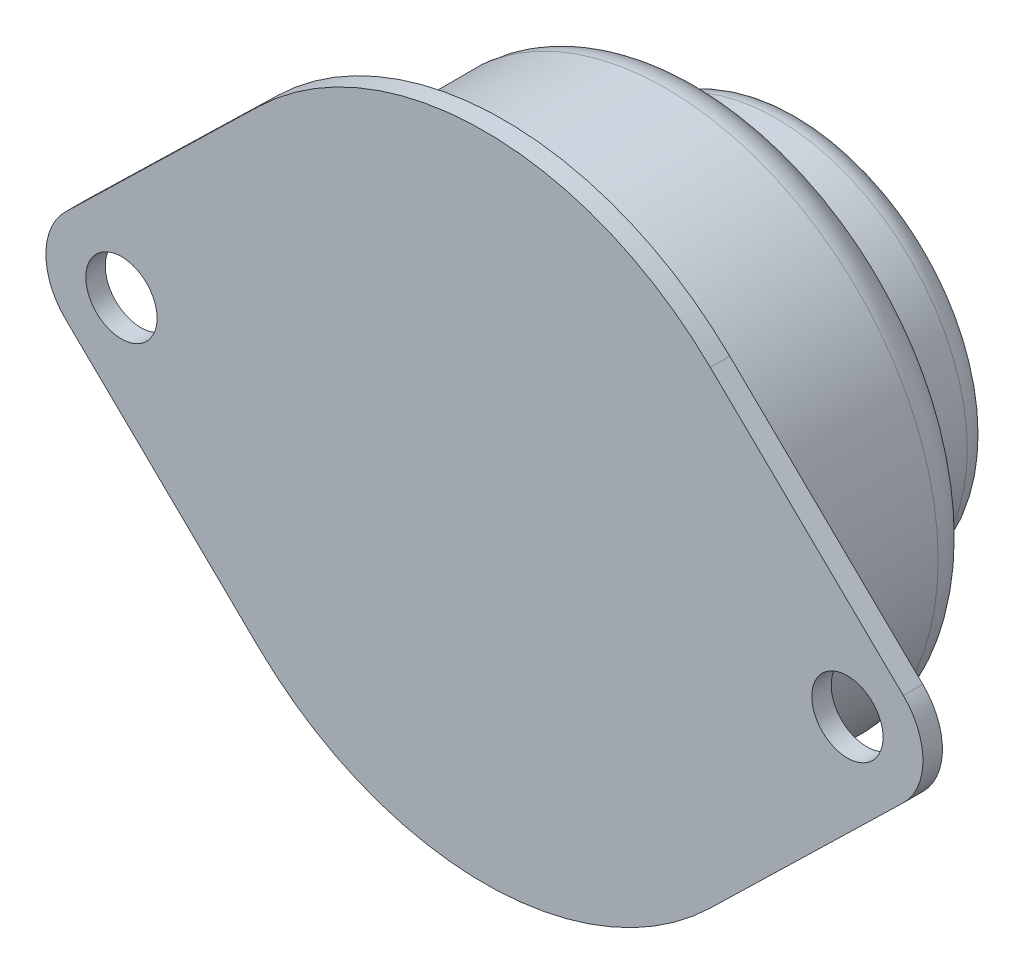
ISO-10303-21;
HEADER;
FILE_DESCRIPTION(('STEP AP214'),'2;1');
FILE_NAME('part.step','',(''),(''),'','','');
FILE_SCHEMA(('AUTOMOTIVE_DESIGN { 1 0 10303 214 1 1 1 1 }'));
ENDSEC;
DATA;
#1=APPLICATION_CONTEXT('core data for automotive mechanical design processes');
#2=APPLICATION_PROTOCOL_DEFINITION('international standard','automotive_design',2000,#1);
#3=PRODUCT_CONTEXT('',#1,'mechanical');
#4=PRODUCT('Part','Part','',(#3));
#5=PRODUCT_RELATED_PRODUCT_CATEGORY('part','',(#4));
#6=PRODUCT_DEFINITION_FORMATION('','',#4);
#7=PRODUCT_DEFINITION_CONTEXT('part definition',#1,'design');
#8=PRODUCT_DEFINITION('design','',#6,#7);
#9=PRODUCT_DEFINITION_SHAPE('','',#8);
#10=(LENGTH_UNIT() NAMED_UNIT(*) SI_UNIT(.MILLI.,.METRE.));
#11=(NAMED_UNIT(*) PLANE_ANGLE_UNIT() SI_UNIT($,.RADIAN.));
#12=(NAMED_UNIT(*) SI_UNIT($,.STERADIAN.) SOLID_ANGLE_UNIT());
#13=UNCERTAINTY_MEASURE_WITH_UNIT(LENGTH_MEASURE(1.E-05),#10,'distance_accuracy_value','');
#14=(GEOMETRIC_REPRESENTATION_CONTEXT(3) GLOBAL_UNCERTAINTY_ASSIGNED_CONTEXT((#13)) GLOBAL_UNIT_ASSIGNED_CONTEXT((#10,
#11,#12)) REPRESENTATION_CONTEXT('',''));
#15=CARTESIAN_POINT('',(0.,0.,0.));
#16=DIRECTION('',(0.,0.,1.));
#17=DIRECTION('',(1.,0.,0.));
#18=AXIS2_PLACEMENT_3D('',#15,#16,#17);
#19=CARTESIAN_POINT('',(0.,0.,1.5));
#20=DIRECTION('',(0.,0.,-1.));
#21=DIRECTION('',(-1.,0.,0.));
#22=AXIS2_PLACEMENT_3D('',#19,#20,#21);
#23=PLANE('',#22);
#24=DIRECTION('',(-0.716994918814431,-0.697078393291808,0.));
#25=VECTOR('',#24,1.);
#26=CARTESIAN_POINT('',(-36.,0.,1.5));
#27=LINE('',#26,#25);
#28=CARTESIAN_POINT('',(-17.4269598322952,18.0571223852685,1.5));
#29=VERTEX_POINT('',#28);
#30=CARTESIAN_POINT('',(-32.3125975603829,3.58497459407215,1.5));
#31=VERTEX_POINT('',#30);
#32=EDGE_CURVE('E141',#29,#31,#27,.T.);
#33=ORIENTED_EDGE('',*,*,#32,.T.);
#34=CARTESIAN_POINT('',(-28.8272055939239,0.,1.5));
#35=DIRECTION('',(0.,0.,-1.));
#36=DIRECTION('',(-1.,0.,0.));
#37=AXIS2_PLACEMENT_3D('',#34,#35,#36);
#38=CIRCLE('',#37,5.);
#39=CARTESIAN_POINT('',(-32.3125975603829,-3.58497459407215,1.5));
#40=VERTEX_POINT('',#39);
#41=EDGE_CURVE('E209',#31,#40,#38,.F.);
#42=ORIENTED_EDGE('',*,*,#41,.T.);
#43=DIRECTION('',(0.716994918814431,-0.697078393291808,0.));
#44=VECTOR('',#43,1.);
#45=CARTESIAN_POINT('',(0.,-35.,1.5));
#46=LINE('',#45,#44);
#47=CARTESIAN_POINT('',(-17.4269598322952,-18.0571223852686,1.5));
#48=VERTEX_POINT('',#47);
#49=EDGE_CURVE('E232',#40,#48,#46,.T.);
#50=ORIENTED_EDGE('',*,*,#49,.T.);
#51=CARTESIAN_POINT('',(0.,-0.132249414907804,1.5));
#52=DIRECTION('',(0.,0.,-1.));
#53=DIRECTION('',(-1.,0.,0.));
#54=AXIS2_PLACEMENT_3D('',#51,#52,#53);
#55=CIRCLE('',#54,25.);
#56=CARTESIAN_POINT('',(17.4269598322952,-18.0571223852686,1.5));
#57=VERTEX_POINT('',#56);
#58=EDGE_CURVE('E184',#48,#57,#55,.F.);
#59=ORIENTED_EDGE('',*,*,#58,.T.);
#60=DIRECTION('',(0.716994918814431,0.697078393291808,0.));
#61=VECTOR('',#60,1.);
#62=CARTESIAN_POINT('',(36.,0.,1.5));
#63=LINE('',#62,#61);
#64=CARTESIAN_POINT('',(32.3125975603829,-3.58497459407216,1.5));
#65=VERTEX_POINT('',#64);
#66=EDGE_CURVE('E127',#57,#65,#63,.T.);
#67=ORIENTED_EDGE('',*,*,#66,.T.);
#68=CARTESIAN_POINT('',(28.8272055939239,0.,1.5));
#69=DIRECTION('',(0.,0.,-1.));
#70=DIRECTION('',(-1.,0.,0.));
#71=AXIS2_PLACEMENT_3D('',#68,#69,#70);
#72=CIRCLE('',#71,5.);
#73=CARTESIAN_POINT('',(32.3125975603829,3.58497459407214,1.5));
#74=VERTEX_POINT('',#73);
#75=EDGE_CURVE('E61',#65,#74,#72,.F.);
#76=ORIENTED_EDGE('',*,*,#75,.T.);
#77=DIRECTION('',(-0.716994918814431,0.697078393291808,0.));
#78=VECTOR('',#77,1.);
#79=CARTESIAN_POINT('',(0.,35.,1.5));
#80=LINE('',#79,#78);
#81=CARTESIAN_POINT('',(17.4269598322952,18.0571223852686,1.5));
#82=VERTEX_POINT('',#81);
#83=EDGE_CURVE('E152',#74,#82,#80,.T.);
#84=ORIENTED_EDGE('',*,*,#83,.T.);
#85=CARTESIAN_POINT('',(0.,0.13224941490779,1.5));
#86=DIRECTION('',(0.,0.,-1.));
#87=DIRECTION('',(-1.,0.,0.));
#88=AXIS2_PLACEMENT_3D('',#85,#86,#87);
#89=CIRCLE('',#88,25.);
#90=EDGE_CURVE('E181',#82,#29,#89,.F.);
#91=ORIENTED_EDGE('',*,*,#90,.T.);
#92=EDGE_LOOP('',(#33,#42,#50,#59,#67,#76,#84,#91));
#93=FACE_BOUND('',#92,.T.);
#94=CARTESIAN_POINT('',(-28.,0.,1.5));
#95=DIRECTION('',(0.,0.,1.));
#96=DIRECTION('',(1.,0.,0.));
#97=AXIS2_PLACEMENT_3D('',#94,#95,#96);
#98=CIRCLE('',#97,2.75);
#99=CARTESIAN_POINT('',(-25.25,0.,1.5));
#100=VERTEX_POINT('',#99);
#101=EDGE_CURVE('E244',#100,#100,#98,.T.);
#102=ORIENTED_EDGE('',*,*,#101,.F.);
#103=EDGE_LOOP('',(#102));
#104=FACE_BOUND('',#103,.T.);
#105=CARTESIAN_POINT('',(28.,0.,1.5));
#106=DIRECTION('',(0.,0.,1.));
#107=DIRECTION('',(1.,0.,0.));
#108=AXIS2_PLACEMENT_3D('',#105,#106,#107);
#109=CIRCLE('',#108,2.75);
#110=CARTESIAN_POINT('',(30.75,0.,1.5));
#111=VERTEX_POINT('',#110);
#112=EDGE_CURVE('E251',#111,#111,#109,.T.);
#113=ORIENTED_EDGE('',*,*,#112,.F.);
#114=EDGE_LOOP('',(#113));
#115=FACE_BOUND('',#114,.T.);
#116=ADVANCED_FACE('F45',(#93,#104,#115),#23,.F.);
#117=CARTESIAN_POINT('',(0.,0.,0.));
#118=DIRECTION('',(0.,0.,-1.));
#119=DIRECTION('',(-1.,0.,0.));
#120=AXIS2_PLACEMENT_3D('',#117,#118,#119);
#121=PLANE('',#120);
#122=CARTESIAN_POINT('',(0.,0.,0.));
#123=DIRECTION('',(0.,0.,-1.));
#124=DIRECTION('',(-1.,0.,0.));
#125=AXIS2_PLACEMENT_3D('',#122,#123,#124);
#126=CIRCLE('',#125,21.);
#127=CARTESIAN_POINT('',(-21.,0.,0.));
#128=VERTEX_POINT('',#127);
#129=EDGE_CURVE('E147',#128,#128,#126,.T.);
#130=ORIENTED_EDGE('',*,*,#129,.F.);
#131=EDGE_LOOP('',(#130));
#132=FACE_BOUND('',#131,.T.);
#133=CARTESIAN_POINT('',(-28.,0.,0.));
#134=DIRECTION('',(0.,0.,1.));
#135=DIRECTION('',(1.,0.,0.));
#136=AXIS2_PLACEMENT_3D('',#133,#134,#135);
#137=CIRCLE('',#136,2.75);
#138=CARTESIAN_POINT('',(-25.25,0.,0.));
#139=VERTEX_POINT('',#138);
#140=EDGE_CURVE('E237',#139,#139,#137,.T.);
#141=ORIENTED_EDGE('',*,*,#140,.T.);
#142=EDGE_LOOP('',(#141));
#143=FACE_BOUND('',#142,.T.);
#144=DIRECTION('',(0.716994918814431,-0.697078393291808,0.));
#145=VECTOR('',#144,1.);
#146=CARTESIAN_POINT('',(0.,-35.,0.));
#147=LINE('',#146,#145);
#148=CARTESIAN_POINT('',(-32.3125975603829,-3.58497459407215,0.));
#149=VERTEX_POINT('',#148);
#150=CARTESIAN_POINT('',(-17.4269598322952,-18.0571223852686,0.));
#151=VERTEX_POINT('',#150);
#152=EDGE_CURVE('E137',#149,#151,#147,.T.);
#153=ORIENTED_EDGE('',*,*,#152,.F.);
#154=CARTESIAN_POINT('',(-28.8272055939239,0.,0.));
#155=DIRECTION('',(0.,0.,-1.));
#156=DIRECTION('',(-1.,0.,0.));
#157=AXIS2_PLACEMENT_3D('',#154,#155,#156);
#158=CIRCLE('',#157,5.);
#159=CARTESIAN_POINT('',(-32.3125975603829,3.58497459407215,0.));
#160=VERTEX_POINT('',#159);
#161=EDGE_CURVE('E201',#149,#160,#158,.T.);
#162=ORIENTED_EDGE('',*,*,#161,.T.);
#163=DIRECTION('',(-0.716994918814431,-0.697078393291808,0.));
#164=VECTOR('',#163,1.);
#165=CARTESIAN_POINT('',(-36.,0.,0.));
#166=LINE('',#165,#164);
#167=CARTESIAN_POINT('',(-17.4269598322952,18.0571223852685,0.));
#168=VERTEX_POINT('',#167);
#169=EDGE_CURVE('E143',#168,#160,#166,.T.);
#170=ORIENTED_EDGE('',*,*,#169,.F.);
#171=CARTESIAN_POINT('',(0.,0.13224941490779,0.));
#172=DIRECTION('',(0.,0.,-1.));
#173=DIRECTION('',(-1.,0.,0.));
#174=AXIS2_PLACEMENT_3D('',#171,#172,#173);
#175=CIRCLE('',#174,25.);
#176=CARTESIAN_POINT('',(17.4269598322952,18.0571223852686,0.));
#177=VERTEX_POINT('',#176);
#178=EDGE_CURVE('E123',#168,#177,#175,.T.);
#179=ORIENTED_EDGE('',*,*,#178,.T.);
#180=DIRECTION('',(-0.716994918814431,0.697078393291808,0.));
#181=VECTOR('',#180,1.);
#182=CARTESIAN_POINT('',(0.,35.,0.));
#183=LINE('',#182,#181);
#184=CARTESIAN_POINT('',(32.3125975603829,3.58497459407214,0.));
#185=VERTEX_POINT('',#184);
#186=EDGE_CURVE('E136',#185,#177,#183,.T.);
#187=ORIENTED_EDGE('',*,*,#186,.F.);
#188=CARTESIAN_POINT('',(28.8272055939239,0.,0.));
#189=DIRECTION('',(0.,0.,-1.));
#190=DIRECTION('',(-1.,0.,0.));
#191=AXIS2_PLACEMENT_3D('',#188,#189,#190);
#192=CIRCLE('',#191,5.);
#193=CARTESIAN_POINT('',(32.3125975603829,-3.58497459407216,0.));
#194=VERTEX_POINT('',#193);
#195=EDGE_CURVE('E134',#185,#194,#192,.T.);
#196=ORIENTED_EDGE('',*,*,#195,.T.);
#197=DIRECTION('',(0.716994918814431,0.697078393291808,0.));
#198=VECTOR('',#197,1.);
#199=CARTESIAN_POINT('',(36.,0.,0.));
#200=LINE('',#199,#198);
#201=CARTESIAN_POINT('',(17.4269598322952,-18.0571223852686,0.));
#202=VERTEX_POINT('',#201);
#203=EDGE_CURVE('E126',#202,#194,#200,.T.);
#204=ORIENTED_EDGE('',*,*,#203,.F.);
#205=CARTESIAN_POINT('',(0.,-0.132249414907804,0.));
#206=DIRECTION('',(0.,0.,-1.));
#207=DIRECTION('',(-1.,0.,0.));
#208=AXIS2_PLACEMENT_3D('',#205,#206,#207);
#209=CIRCLE('',#208,25.);
#210=EDGE_CURVE('E112',#202,#151,#209,.T.);
#211=ORIENTED_EDGE('',*,*,#210,.T.);
#212=EDGE_LOOP('',(#153,#162,#170,#179,#187,#196,#204,#211));
#213=FACE_BOUND('',#212,.T.);
#214=CARTESIAN_POINT('',(28.,0.,0.));
#215=DIRECTION('',(0.,0.,1.));
#216=DIRECTION('',(1.,0.,0.));
#217=AXIS2_PLACEMENT_3D('',#214,#215,#216);
#218=CIRCLE('',#217,2.75);
#219=CARTESIAN_POINT('',(30.75,0.,0.));
#220=VERTEX_POINT('',#219);
#221=EDGE_CURVE('E165',#220,#220,#218,.T.);
#222=ORIENTED_EDGE('',*,*,#221,.T.);
#223=EDGE_LOOP('',(#222));
#224=FACE_BOUND('',#223,.T.);
#225=ADVANCED_FACE('F131',(#132,#143,#213,#224),#121,.T.);
#226=CARTESIAN_POINT('',(-36.,0.,1.5));
#227=DIRECTION('',(0.697078393291808,-0.71699491881443,0.));
#228=DIRECTION('',(0.71699491881443,0.697078393291808,0.));
#229=AXIS2_PLACEMENT_3D('',#226,#227,#228);
#230=PLANE('',#229);
#231=ORIENTED_EDGE('',*,*,#169,.T.);
#232=DIRECTION('',(0.,0.,-1.));
#233=VECTOR('',#232,1.);
#234=CARTESIAN_POINT('',(-32.3125975603829,3.58497459407215,1.5));
#235=LINE('',#234,#233);
#236=EDGE_CURVE('E204',#160,#31,#235,.F.);
#237=ORIENTED_EDGE('',*,*,#236,.T.);
#238=ORIENTED_EDGE('',*,*,#32,.F.);
#239=DIRECTION('',(0.,0.,-1.));
#240=VECTOR('',#239,1.);
#241=CARTESIAN_POINT('',(-17.4269598322952,18.0571223852685,1.5));
#242=LINE('',#241,#240);
#243=EDGE_CURVE('E187',#29,#168,#242,.T.);
#244=ORIENTED_EDGE('',*,*,#243,.T.);
#245=EDGE_LOOP('',(#231,#237,#238,#244));
#246=FACE_BOUND('',#245,.T.);
#247=ADVANCED_FACE('F229',(#246),#230,.F.);
#248=CARTESIAN_POINT('',(0.,-35.,1.5));
#249=DIRECTION('',(0.697078393291808,0.716994918814431,0.));
#250=DIRECTION('',(-0.716994918814431,0.697078393291808,0.));
#251=AXIS2_PLACEMENT_3D('',#248,#249,#250);
#252=PLANE('',#251);
#253=ORIENTED_EDGE('',*,*,#49,.F.);
#254=DIRECTION('',(0.,0.,-1.));
#255=VECTOR('',#254,1.);
#256=CARTESIAN_POINT('',(-32.3125975603829,-3.58497459407216,1.5));
#257=LINE('',#256,#255);
#258=EDGE_CURVE('E195',#40,#149,#257,.T.);
#259=ORIENTED_EDGE('',*,*,#258,.T.);
#260=ORIENTED_EDGE('',*,*,#152,.T.);
#261=DIRECTION('',(0.,0.,-1.));
#262=VECTOR('',#261,1.);
#263=CARTESIAN_POINT('',(-17.4269598322952,-18.0571223852686,1.5));
#264=LINE('',#263,#262);
#265=EDGE_CURVE('E118',#151,#48,#264,.F.);
#266=ORIENTED_EDGE('',*,*,#265,.T.);
#267=EDGE_LOOP('',(#253,#259,#260,#266));
#268=FACE_BOUND('',#267,.T.);
#269=ADVANCED_FACE('F279',(#268),#252,.F.);
#270=CARTESIAN_POINT('',(36.,0.,1.5));
#271=DIRECTION('',(-0.697078393291808,0.716994918814431,0.));
#272=DIRECTION('',(-0.716994918814431,-0.697078393291808,0.));
#273=AXIS2_PLACEMENT_3D('',#270,#271,#272);
#274=PLANE('',#273);
#275=ORIENTED_EDGE('',*,*,#203,.T.);
#276=DIRECTION('',(0.,0.,-1.));
#277=VECTOR('',#276,1.);
#278=CARTESIAN_POINT('',(32.3125975603829,-3.58497459407216,1.5));
#279=LINE('',#278,#277);
#280=EDGE_CURVE('E11',#194,#65,#279,.F.);
#281=ORIENTED_EDGE('',*,*,#280,.T.);
#282=ORIENTED_EDGE('',*,*,#66,.F.);
#283=DIRECTION('',(0.,0.,-1.));
#284=VECTOR('',#283,1.);
#285=CARTESIAN_POINT('',(17.4269598322952,-18.0571223852686,1.5));
#286=LINE('',#285,#284);
#287=EDGE_CURVE('E116',#57,#202,#286,.T.);
#288=ORIENTED_EDGE('',*,*,#287,.T.);
#289=EDGE_LOOP('',(#275,#281,#282,#288));
#290=FACE_BOUND('',#289,.T.);
#291=ADVANCED_FACE('F125',(#290),#274,.F.);
#292=CARTESIAN_POINT('',(0.,35.,1.5));
#293=DIRECTION('',(-0.697078393291808,-0.716994918814431,0.));
#294=DIRECTION('',(0.716994918814431,-0.697078393291808,0.));
#295=AXIS2_PLACEMENT_3D('',#292,#293,#294);
#296=PLANE('',#295);
#297=ORIENTED_EDGE('',*,*,#83,.F.);
#298=DIRECTION('',(0.,0.,-1.));
#299=VECTOR('',#298,1.);
#300=CARTESIAN_POINT('',(32.3125975603829,3.58497459407214,1.5));
#301=LINE('',#300,#299);
#302=EDGE_CURVE('E54',#74,#185,#301,.T.);
#303=ORIENTED_EDGE('',*,*,#302,.T.);
#304=ORIENTED_EDGE('',*,*,#186,.T.);
#305=DIRECTION('',(0.,0.,-1.));
#306=VECTOR('',#305,1.);
#307=CARTESIAN_POINT('',(17.4269598322952,18.0571223852686,1.5));
#308=LINE('',#307,#306);
#309=EDGE_CURVE('E191',#177,#82,#308,.F.);
#310=ORIENTED_EDGE('',*,*,#309,.T.);
#311=EDGE_LOOP('',(#297,#303,#304,#310));
#312=FACE_BOUND('',#311,.T.);
#313=ADVANCED_FACE('F215',(#312),#296,.F.);
#314=CARTESIAN_POINT('',(-28.,0.,1.5));
#315=DIRECTION('',(0.,0.,-1.));
#316=DIRECTION('',(-1.,0.,0.));
#317=AXIS2_PLACEMENT_3D('',#314,#315,#316);
#318=CYLINDRICAL_SURFACE('',#317,2.75);
#319=ORIENTED_EDGE('',*,*,#101,.T.);
#320=EDGE_LOOP('',(#319));
#321=FACE_BOUND('',#320,.T.);
#322=ORIENTED_EDGE('',*,*,#140,.F.);
#323=EDGE_LOOP('',(#322));
#324=FACE_BOUND('',#323,.T.);
#325=ADVANCED_FACE('F272',(#321,#324),#318,.F.);
#326=CARTESIAN_POINT('',(28.,0.,1.5));
#327=DIRECTION('',(0.,0.,-1.));
#328=DIRECTION('',(-1.,0.,0.));
#329=AXIS2_PLACEMENT_3D('',#326,#327,#328);
#330=CYLINDRICAL_SURFACE('',#329,2.75);
#331=ORIENTED_EDGE('',*,*,#112,.T.);
#332=EDGE_LOOP('',(#331));
#333=FACE_BOUND('',#332,.T.);
#334=ORIENTED_EDGE('',*,*,#221,.F.);
#335=EDGE_LOOP('',(#334));
#336=FACE_BOUND('',#335,.T.);
#337=ADVANCED_FACE('F260',(#333,#336),#330,.F.);
#338=CARTESIAN_POINT('',(0.,0.,-15.5));
#339=DIRECTION('',(0.,0.,1.));
#340=DIRECTION('',(1.,0.,0.));
#341=AXIS2_PLACEMENT_3D('',#338,#339,#340);
#342=CYLINDRICAL_SURFACE('',#341,21.);
#343=CARTESIAN_POINT('',(0.,0.,-12.5));
#344=DIRECTION('',(0.,0.,1.));
#345=DIRECTION('',(1.,0.,0.));
#346=AXIS2_PLACEMENT_3D('',#343,#344,#345);
#347=CIRCLE('',#346,21.);
#348=CARTESIAN_POINT('',(21.,0.,-12.5));
#349=VERTEX_POINT('',#348);
#350=EDGE_CURVE('E151',#349,#349,#347,.T.);
#351=ORIENTED_EDGE('',*,*,#350,.T.);
#352=EDGE_LOOP('',(#351));
#353=FACE_BOUND('',#352,.T.);
#354=ORIENTED_EDGE('',*,*,#129,.T.);
#355=EDGE_LOOP('',(#354));
#356=FACE_BOUND('',#355,.T.);
#357=ADVANCED_FACE('F375',(#353,#356),#342,.T.);
#358=CARTESIAN_POINT('',(0.,0.,-15.5));
#359=DIRECTION('',(0.,0.,1.));
#360=DIRECTION('',(1.,0.,0.));
#361=AXIS2_PLACEMENT_3D('',#358,#359,#360);
#362=PLANE('',#361);
#363=CARTESIAN_POINT('',(0.,0.,-15.5));
#364=DIRECTION('',(0.,0.,1.));
#365=DIRECTION('',(1.,0.,0.));
#366=AXIS2_PLACEMENT_3D('',#363,#364,#365);
#367=CIRCLE('',#366,14.75);
#368=CARTESIAN_POINT('',(14.75,0.,-15.5));
#369=VERTEX_POINT('',#368);
#370=EDGE_CURVE('E160',#369,#369,#367,.F.);
#371=ORIENTED_EDGE('',*,*,#370,.F.);
#372=EDGE_LOOP('',(#371));
#373=FACE_BOUND('',#372,.T.);
#374=CARTESIAN_POINT('',(0.,0.,-15.5));
#375=DIRECTION('',(0.,0.,1.));
#376=DIRECTION('',(1.,0.,0.));
#377=AXIS2_PLACEMENT_3D('',#374,#375,#376);
#378=CIRCLE('',#377,18.);
#379=CARTESIAN_POINT('',(18.,0.,-15.5));
#380=VERTEX_POINT('',#379);
#381=EDGE_CURVE('E156',#380,#380,#378,.F.);
#382=ORIENTED_EDGE('',*,*,#381,.T.);
#383=EDGE_LOOP('',(#382));
#384=FACE_BOUND('',#383,.T.);
#385=ADVANCED_FACE('F289',(#373,#384),#362,.F.);
#386=CARTESIAN_POINT('',(0.,0.,-12.5));
#387=DIRECTION('',(0.,0.,1.));
#388=DIRECTION('',(1.,0.,0.));
#389=AXIS2_PLACEMENT_3D('',#386,#387,#388);
#390=TOROIDAL_SURFACE('',#389,18.,3.);
#391=ORIENTED_EDGE('',*,*,#381,.F.);
#392=EDGE_LOOP('',(#391));
#393=FACE_BOUND('',#392,.T.);
#394=ORIENTED_EDGE('',*,*,#350,.F.);
#395=EDGE_LOOP('',(#394));
#396=FACE_BOUND('',#395,.T.);
#397=ADVANCED_FACE('F285',(#393,#396),#390,.T.);
#398=CARTESIAN_POINT('',(0.,0.,-23.));
#399=DIRECTION('',(0.,0.,1.));
#400=DIRECTION('',(1.,0.,0.));
#401=AXIS2_PLACEMENT_3D('',#398,#399,#400);
#402=CYLINDRICAL_SURFACE('',#401,14.75);
#403=CARTESIAN_POINT('',(0.,0.,-21.));
#404=DIRECTION('',(0.,0.,-1.));
#405=DIRECTION('',(-1.,0.,0.));
#406=AXIS2_PLACEMENT_3D('',#403,#404,#405);
#407=CIRCLE('',#406,14.75);
#408=CARTESIAN_POINT('',(-14.75,0.,-21.));
#409=VERTEX_POINT('',#408);
#410=EDGE_CURVE('E129',#409,#409,#407,.F.);
#411=ORIENTED_EDGE('',*,*,#410,.T.);
#412=EDGE_LOOP('',(#411));
#413=FACE_BOUND('',#412,.T.);
#414=ORIENTED_EDGE('',*,*,#370,.T.);
#415=EDGE_LOOP('',(#414));
#416=FACE_BOUND('',#415,.T.);
#417=ADVANCED_FACE('F288',(#413,#416),#402,.T.);
#418=CARTESIAN_POINT('',(0.,0.,-23.));
#419=DIRECTION('',(0.,0.,-1.));
#420=DIRECTION('',(-1.,0.,0.));
#421=AXIS2_PLACEMENT_3D('',#418,#419,#420);
#422=PLANE('',#421);
#423=CARTESIAN_POINT('',(0.,0.,-23.));
#424=DIRECTION('',(0.,0.,-1.));
#425=DIRECTION('',(-1.,0.,0.));
#426=AXIS2_PLACEMENT_3D('',#423,#424,#425);
#427=CIRCLE('',#426,12.75);
#428=CARTESIAN_POINT('',(-12.75,0.,-23.));
#429=VERTEX_POINT('',#428);
#430=EDGE_CURVE('E169',#429,#429,#427,.T.);
#431=ORIENTED_EDGE('',*,*,#430,.T.);
#432=EDGE_LOOP('',(#431));
#433=FACE_BOUND('',#432,.T.);
#434=CARTESIAN_POINT('',(0.,0.,-23.));
#435=DIRECTION('',(0.,0.,-1.));
#436=DIRECTION('',(-1.,0.,0.));
#437=AXIS2_PLACEMENT_3D('',#434,#435,#436);
#438=CIRCLE('',#437,11.0837719211467);
#439=CARTESIAN_POINT('',(-11.0837719211467,0.,-23.));
#440=VERTEX_POINT('',#439);
#441=EDGE_CURVE('E161',#440,#440,#438,.T.);
#442=ORIENTED_EDGE('',*,*,#441,.F.);
#443=EDGE_LOOP('',(#442));
#444=FACE_BOUND('',#443,.T.);
#445=ADVANCED_FACE('F337',(#433,#444),#422,.T.);
#446=CARTESIAN_POINT('',(0.,0.,-16.8));
#447=DIRECTION('',(0.,-1.,0.));
#448=DIRECTION('',(1.,0.,0.));
#449=AXIS2_PLACEMENT_3D('',#446,#447,#448);
#450=SPHERICAL_SURFACE('',#449,12.7);
#451=CARTESIAN_POINT('',(0.,0.,-16.8));
#452=DIRECTION('',(0.,0.,-1.));
#453=DIRECTION('',(-1.,0.,0.));
#454=AXIS2_PLACEMENT_3D('',#451,#452,#453);
#455=SPHERICAL_SURFACE('',#454,12.7);
#456=ORIENTED_EDGE('',*,*,#441,.T.);
#457=EDGE_LOOP('',(#456));
#458=FACE_BOUND('',#457,.T.);
#459=ADVANCED_FACE('F294',(#458),#455,.T.);
#460=CARTESIAN_POINT('',(0.,0.,-21.));
#461=DIRECTION('',(0.,0.,-1.));
#462=DIRECTION('',(-1.,0.,0.));
#463=AXIS2_PLACEMENT_3D('',#460,#461,#462);
#464=TOROIDAL_SURFACE('',#463,12.75,2.);
#465=ORIENTED_EDGE('',*,*,#410,.F.);
#466=EDGE_LOOP('',(#465));
#467=FACE_BOUND('',#466,.T.);
#468=ORIENTED_EDGE('',*,*,#430,.F.);
#469=EDGE_LOOP('',(#468));
#470=FACE_BOUND('',#469,.T.);
#471=ADVANCED_FACE('F291',(#467,#470),#464,.T.);
#472=CARTESIAN_POINT('',(0.,-0.132249414907804,1.5));
#473=DIRECTION('',(0.,0.,-1.));
#474=DIRECTION('',(-1.,0.,0.));
#475=AXIS2_PLACEMENT_3D('',#472,#473,#474);
#476=CYLINDRICAL_SURFACE('',#475,25.);
#477=ORIENTED_EDGE('',*,*,#58,.F.);
#478=ORIENTED_EDGE('',*,*,#265,.F.);
#479=ORIENTED_EDGE('',*,*,#210,.F.);
#480=ORIENTED_EDGE('',*,*,#287,.F.);
#481=EDGE_LOOP('',(#477,#478,#479,#480));
#482=FACE_BOUND('',#481,.T.);
#483=ADVANCED_FACE('F115',(#482),#476,.T.);
#484=CARTESIAN_POINT('',(0.,0.13224941490779,1.5));
#485=DIRECTION('',(0.,0.,-1.));
#486=DIRECTION('',(-1.,0.,0.));
#487=AXIS2_PLACEMENT_3D('',#484,#485,#486);
#488=CYLINDRICAL_SURFACE('',#487,25.);
#489=ORIENTED_EDGE('',*,*,#90,.F.);
#490=ORIENTED_EDGE('',*,*,#309,.F.);
#491=ORIENTED_EDGE('',*,*,#178,.F.);
#492=ORIENTED_EDGE('',*,*,#243,.F.);
#493=EDGE_LOOP('',(#489,#490,#491,#492));
#494=FACE_BOUND('',#493,.T.);
#495=ADVANCED_FACE('F223',(#494),#488,.T.);
#496=CARTESIAN_POINT('',(-28.8272055939239,0.,1.5));
#497=DIRECTION('',(0.,0.,-1.));
#498=DIRECTION('',(-1.,0.,0.));
#499=AXIS2_PLACEMENT_3D('',#496,#497,#498);
#500=CYLINDRICAL_SURFACE('',#499,5.);
#501=ORIENTED_EDGE('',*,*,#41,.F.);
#502=ORIENTED_EDGE('',*,*,#236,.F.);
#503=ORIENTED_EDGE('',*,*,#161,.F.);
#504=ORIENTED_EDGE('',*,*,#258,.F.);
#505=EDGE_LOOP('',(#501,#502,#503,#504));
#506=FACE_BOUND('',#505,.T.);
#507=ADVANCED_FACE('F298',(#506),#500,.T.);
#508=CARTESIAN_POINT('',(28.8272055939239,0.,1.5));
#509=DIRECTION('',(0.,0.,-1.));
#510=DIRECTION('',(-1.,0.,0.));
#511=AXIS2_PLACEMENT_3D('',#508,#509,#510);
#512=CYLINDRICAL_SURFACE('',#511,5.);
#513=ORIENTED_EDGE('',*,*,#75,.F.);
#514=ORIENTED_EDGE('',*,*,#280,.F.);
#515=ORIENTED_EDGE('',*,*,#195,.F.);
#516=ORIENTED_EDGE('',*,*,#302,.F.);
#517=EDGE_LOOP('',(#513,#514,#515,#516));
#518=FACE_BOUND('',#517,.T.);
#519=ADVANCED_FACE('F47',(#518),#512,.T.);
#520=CLOSED_SHELL('',(#116,#225,#247,#269,#291,#313,#325,#337,#357,#385,#397,#417,#445,#459,
#471,#483,#495,#507,#519));
#521=MANIFOLD_SOLID_BREP('B2',#520);
#522=ADVANCED_BREP_SHAPE_REPRESENTATION('',(#18,#521),#14);
#523=SHAPE_DEFINITION_REPRESENTATION(#9,#522);
ENDSEC;
END-ISO-10303-21;
